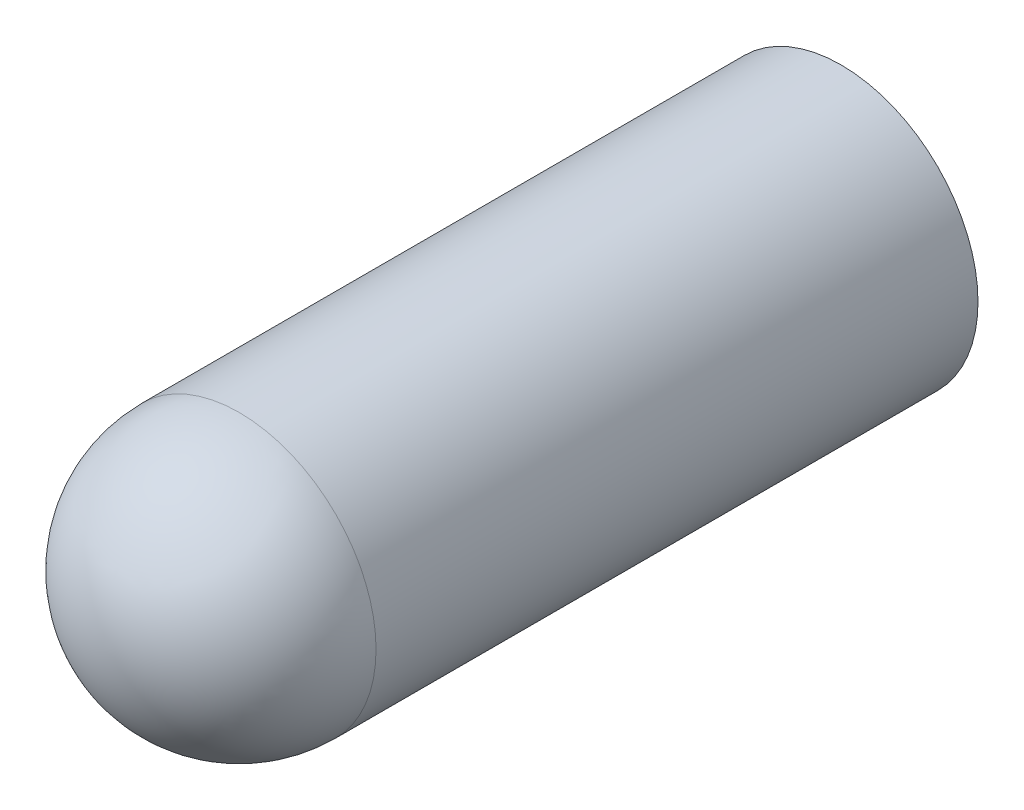
ISO-10303-21;
HEADER;
FILE_DESCRIPTION(('STEP AP214'),'2;1');
FILE_NAME('part.step','',(''),(''),'','','');
FILE_SCHEMA(('AUTOMOTIVE_DESIGN { 1 0 10303 214 1 1 1 1 }'));
ENDSEC;
DATA;
#1=APPLICATION_CONTEXT('core data for automotive mechanical design processes');
#2=APPLICATION_PROTOCOL_DEFINITION('international standard','automotive_design',2000,#1);
#3=PRODUCT_CONTEXT('',#1,'mechanical');
#4=PRODUCT('Part','Part','',(#3));
#5=PRODUCT_RELATED_PRODUCT_CATEGORY('part','',(#4));
#6=PRODUCT_DEFINITION_FORMATION('','',#4);
#7=PRODUCT_DEFINITION_CONTEXT('part definition',#1,'design');
#8=PRODUCT_DEFINITION('design','',#6,#7);
#9=PRODUCT_DEFINITION_SHAPE('','',#8);
#10=(LENGTH_UNIT() NAMED_UNIT(*) SI_UNIT(.MILLI.,.METRE.));
#11=(NAMED_UNIT(*) PLANE_ANGLE_UNIT() SI_UNIT($,.RADIAN.));
#12=(NAMED_UNIT(*) SI_UNIT($,.STERADIAN.) SOLID_ANGLE_UNIT());
#13=UNCERTAINTY_MEASURE_WITH_UNIT(LENGTH_MEASURE(1.E-05),#10,'distance_accuracy_value','');
#14=(GEOMETRIC_REPRESENTATION_CONTEXT(3) GLOBAL_UNCERTAINTY_ASSIGNED_CONTEXT((#13)) GLOBAL_UNIT_ASSIGNED_CONTEXT((#10,
#11,#12)) REPRESENTATION_CONTEXT('',''));
#15=CARTESIAN_POINT('',(0.,0.,0.));
#16=DIRECTION('',(0.,0.,1.));
#17=DIRECTION('',(1.,0.,0.));
#18=AXIS2_PLACEMENT_3D('',#15,#16,#17);
#19=CARTESIAN_POINT('',(0.,0.,5.5));
#20=DIRECTION('',(0.,0.,-1.));
#21=DIRECTION('',(-1.,0.,0.));
#22=AXIS2_PLACEMENT_3D('',#19,#20,#21);
#23=CYLINDRICAL_SURFACE('',#22,2.5);
#24=CARTESIAN_POINT('',(0.,0.,5.5));
#25=DIRECTION('',(0.,0.,1.));
#26=DIRECTION('',(1.,0.,0.));
#27=AXIS2_PLACEMENT_3D('',#24,#25,#26);
#28=CIRCLE('',#27,2.5);
#29=CARTESIAN_POINT('',(2.5,0.,5.5));
#30=VERTEX_POINT('',#29);
#31=EDGE_CURVE('E10',#30,#30,#28,.T.);
#32=ORIENTED_EDGE('',*,*,#31,.F.);
#33=EDGE_LOOP('',(#32));
#34=FACE_BOUND('',#33,.T.);
#35=CARTESIAN_POINT('',(0.,0.,-5.5));
#36=DIRECTION('',(0.,0.,1.));
#37=DIRECTION('',(1.,0.,0.));
#38=AXIS2_PLACEMENT_3D('',#35,#36,#37);
#39=CIRCLE('',#38,2.5);
#40=CARTESIAN_POINT('',(2.5,0.,-5.5));
#41=VERTEX_POINT('',#40);
#42=EDGE_CURVE('E40',#41,#41,#39,.T.);
#43=ORIENTED_EDGE('',*,*,#42,.T.);
#44=EDGE_LOOP('',(#43));
#45=FACE_BOUND('',#44,.T.);
#46=ADVANCED_FACE('F37',(#34,#45),#23,.T.);
#47=CARTESIAN_POINT('',(0.,0.,-5.5));
#48=DIRECTION('',(0.,0.,1.));
#49=DIRECTION('',(1.,0.,0.));
#50=AXIS2_PLACEMENT_3D('',#47,#48,#49);
#51=PLANE('',#50);
#52=ORIENTED_EDGE('',*,*,#42,.F.);
#53=EDGE_LOOP('',(#52));
#54=FACE_BOUND('',#53,.T.);
#55=ADVANCED_FACE('F50',(#54),#51,.F.);
#56=CARTESIAN_POINT('',(0.,0.,5.5));
#57=DIRECTION('',(0.,0.,-1.));
#58=DIRECTION('',(0.,1.,0.));
#59=AXIS2_PLACEMENT_3D('',#56,#57,#58);
#60=SPHERICAL_SURFACE('',#59,2.5);
#61=ORIENTED_EDGE('',*,*,#31,.T.);
#62=EDGE_LOOP('',(#61));
#63=FACE_BOUND('',#62,.T.);
#64=ADVANCED_FACE('F52',(#63),#60,.T.);
#65=CLOSED_SHELL('',(#46,#55,#64));
#66=MANIFOLD_SOLID_BREP('B2',#65);
#67=ADVANCED_BREP_SHAPE_REPRESENTATION('',(#18,#66),#14);
#68=SHAPE_DEFINITION_REPRESENTATION(#9,#67);
ENDSEC;
END-ISO-10303-21;
